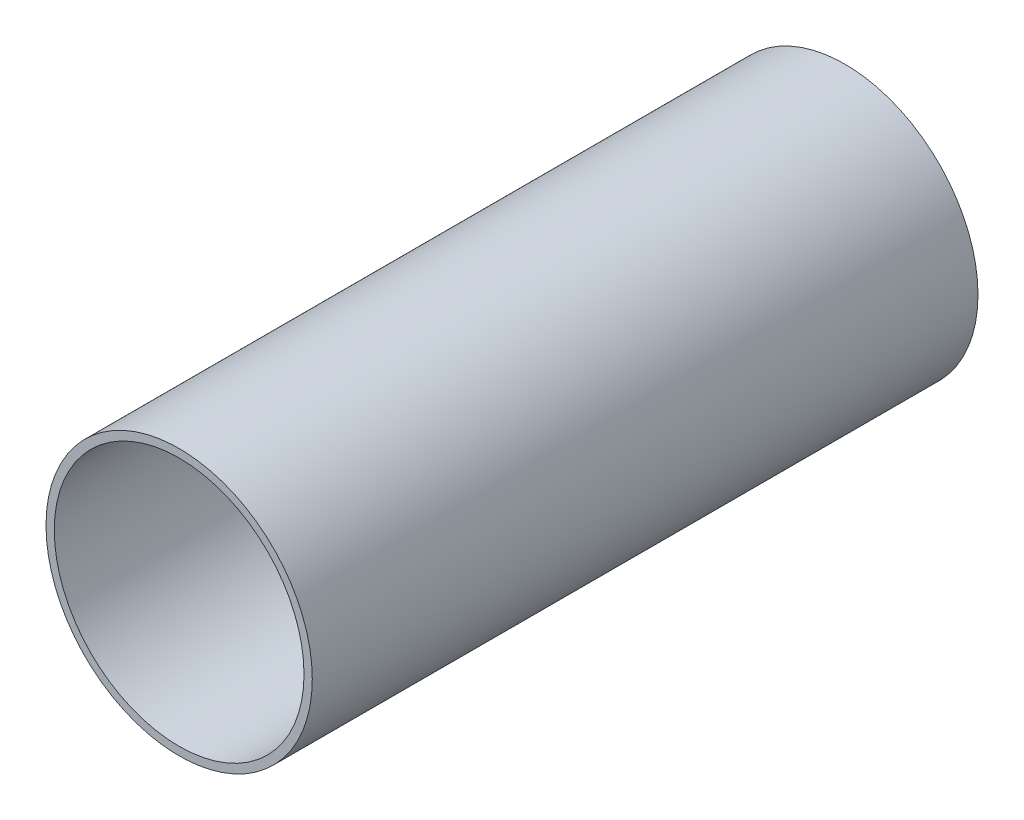
ISO-10303-21;
HEADER;
FILE_DESCRIPTION(('STEP AP214'),'2;1');
FILE_NAME('part.step','',(''),(''),'','','');
FILE_SCHEMA(('AUTOMOTIVE_DESIGN { 1 0 10303 214 1 1 1 1 }'));
ENDSEC;
DATA;
#1=APPLICATION_CONTEXT('core data for automotive mechanical design processes');
#2=APPLICATION_PROTOCOL_DEFINITION('international standard','automotive_design',2000,#1);
#3=PRODUCT_CONTEXT('',#1,'mechanical');
#4=PRODUCT('Part','Part','',(#3));
#5=PRODUCT_RELATED_PRODUCT_CATEGORY('part','',(#4));
#6=PRODUCT_DEFINITION_FORMATION('','',#4);
#7=PRODUCT_DEFINITION_CONTEXT('part definition',#1,'design');
#8=PRODUCT_DEFINITION('design','',#6,#7);
#9=PRODUCT_DEFINITION_SHAPE('','',#8);
#10=(LENGTH_UNIT() NAMED_UNIT(*) SI_UNIT(.MILLI.,.METRE.));
#11=(NAMED_UNIT(*) PLANE_ANGLE_UNIT() SI_UNIT($,.RADIAN.));
#12=(NAMED_UNIT(*) SI_UNIT($,.STERADIAN.) SOLID_ANGLE_UNIT());
#13=UNCERTAINTY_MEASURE_WITH_UNIT(LENGTH_MEASURE(1.E-05),#10,'distance_accuracy_value','');
#14=(GEOMETRIC_REPRESENTATION_CONTEXT(3) GLOBAL_UNCERTAINTY_ASSIGNED_CONTEXT((#13)) GLOBAL_UNIT_ASSIGNED_CONTEXT((#10,
#11,#12)) REPRESENTATION_CONTEXT('',''));
#15=CARTESIAN_POINT('',(0.,0.,0.));
#16=DIRECTION('',(0.,0.,1.));
#17=DIRECTION('',(1.,0.,0.));
#18=AXIS2_PLACEMENT_3D('',#15,#16,#17);
#19=CARTESIAN_POINT('',(0.,0.,254.));
#20=DIRECTION('',(0.,0.,1.));
#21=DIRECTION('',(1.,0.,0.));
#22=AXIS2_PLACEMENT_3D('',#19,#20,#21);
#23=PLANE('',#22);
#24=CARTESIAN_POINT('',(0.,0.,254.));
#25=DIRECTION('',(0.,0.,1.));
#26=DIRECTION('',(1.,0.,0.));
#27=AXIS2_PLACEMENT_3D('',#24,#25,#26);
#28=CIRCLE('',#27,50.8);
#29=CARTESIAN_POINT('',(50.8,0.,254.));
#30=VERTEX_POINT('',#29);
#31=EDGE_CURVE('E10',#30,#30,#28,.T.);
#32=ORIENTED_EDGE('',*,*,#31,.T.);
#33=EDGE_LOOP('',(#32));
#34=FACE_BOUND('',#33,.T.);
#35=CARTESIAN_POINT('',(0.,0.,254.));
#36=DIRECTION('',(0.,0.,1.));
#37=DIRECTION('',(1.,0.,0.));
#38=AXIS2_PLACEMENT_3D('',#35,#36,#37);
#39=CIRCLE('',#38,47.645753053809);
#40=CARTESIAN_POINT('',(47.645753053809,0.,254.));
#41=VERTEX_POINT('',#40);
#42=EDGE_CURVE('E44',#41,#41,#39,.T.);
#43=ORIENTED_EDGE('',*,*,#42,.F.);
#44=EDGE_LOOP('',(#43));
#45=FACE_BOUND('',#44,.T.);
#46=ADVANCED_FACE('F33',(#34,#45),#23,.T.);
#47=CARTESIAN_POINT('',(0.,0.,0.));
#48=DIRECTION('',(0.,0.,1.));
#49=DIRECTION('',(1.,0.,0.));
#50=AXIS2_PLACEMENT_3D('',#47,#48,#49);
#51=PLANE('',#50);
#52=CARTESIAN_POINT('',(0.,0.,0.));
#53=DIRECTION('',(0.,0.,1.));
#54=DIRECTION('',(1.,0.,0.));
#55=AXIS2_PLACEMENT_3D('',#52,#53,#54);
#56=CIRCLE('',#55,50.8);
#57=CARTESIAN_POINT('',(50.8,0.,0.));
#58=VERTEX_POINT('',#57);
#59=EDGE_CURVE('E37',#58,#58,#56,.T.);
#60=ORIENTED_EDGE('',*,*,#59,.F.);
#61=EDGE_LOOP('',(#60));
#62=FACE_BOUND('',#61,.T.);
#63=CARTESIAN_POINT('',(0.,0.,0.));
#64=DIRECTION('',(0.,0.,1.));
#65=DIRECTION('',(1.,0.,0.));
#66=AXIS2_PLACEMENT_3D('',#63,#64,#65);
#67=CIRCLE('',#66,47.645753053809);
#68=CARTESIAN_POINT('',(47.645753053809,0.,0.));
#69=VERTEX_POINT('',#68);
#70=EDGE_CURVE('E46',#69,#69,#67,.T.);
#71=ORIENTED_EDGE('',*,*,#70,.T.);
#72=EDGE_LOOP('',(#71));
#73=FACE_BOUND('',#72,.T.);
#74=ADVANCED_FACE('F56',(#62,#73),#51,.F.);
#75=CARTESIAN_POINT('',(0.,0.,254.));
#76=DIRECTION('',(0.,0.,-1.));
#77=DIRECTION('',(-1.,0.,0.));
#78=AXIS2_PLACEMENT_3D('',#75,#76,#77);
#79=CYLINDRICAL_SURFACE('',#78,50.8);
#80=ORIENTED_EDGE('',*,*,#31,.F.);
#81=EDGE_LOOP('',(#80));
#82=FACE_BOUND('',#81,.T.);
#83=ORIENTED_EDGE('',*,*,#59,.T.);
#84=EDGE_LOOP('',(#83));
#85=FACE_BOUND('',#84,.T.);
#86=ADVANCED_FACE('F35',(#82,#85),#79,.T.);
#87=CARTESIAN_POINT('',(0.,0.,254.));
#88=DIRECTION('',(0.,0.,-1.));
#89=DIRECTION('',(-1.,0.,0.));
#90=AXIS2_PLACEMENT_3D('',#87,#88,#89);
#91=CYLINDRICAL_SURFACE('',#90,47.645753053809);
#92=ORIENTED_EDGE('',*,*,#42,.T.);
#93=EDGE_LOOP('',(#92));
#94=FACE_BOUND('',#93,.T.);
#95=ORIENTED_EDGE('',*,*,#70,.F.);
#96=EDGE_LOOP('',(#95));
#97=FACE_BOUND('',#96,.T.);
#98=ADVANCED_FACE('F52',(#94,#97),#91,.F.);
#99=CLOSED_SHELL('',(#46,#74,#86,#98));
#100=MANIFOLD_SOLID_BREP('B2',#99);
#101=ADVANCED_BREP_SHAPE_REPRESENTATION('',(#18,#100),#14);
#102=SHAPE_DEFINITION_REPRESENTATION(#9,#101);
ENDSEC;
END-ISO-10303-21;
